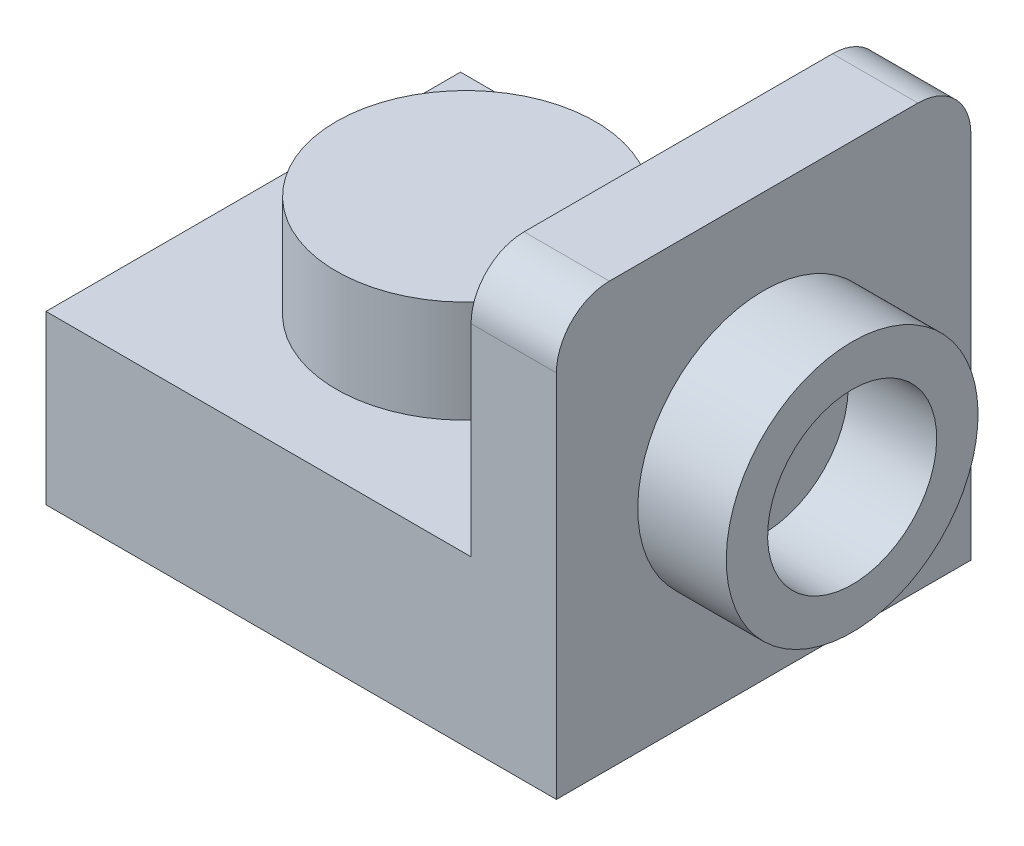
ISO-10303-21;
HEADER;
FILE_DESCRIPTION(('STEP AP214'),'2;1');
FILE_NAME('part.step','',(''),(''),'','','');
FILE_SCHEMA(('AUTOMOTIVE_DESIGN { 1 0 10303 214 1 1 1 1 }'));
ENDSEC;
DATA;
#1=APPLICATION_CONTEXT('core data for automotive mechanical design processes');
#2=APPLICATION_PROTOCOL_DEFINITION('international standard','automotive_design',2000,#1);
#3=PRODUCT_CONTEXT('',#1,'mechanical');
#4=PRODUCT('Part','Part','',(#3));
#5=PRODUCT_RELATED_PRODUCT_CATEGORY('part','',(#4));
#6=PRODUCT_DEFINITION_FORMATION('','',#4);
#7=PRODUCT_DEFINITION_CONTEXT('part definition',#1,'design');
#8=PRODUCT_DEFINITION('design','',#6,#7);
#9=PRODUCT_DEFINITION_SHAPE('','',#8);
#10=(LENGTH_UNIT() NAMED_UNIT(*) SI_UNIT(.MILLI.,.METRE.));
#11=(NAMED_UNIT(*) PLANE_ANGLE_UNIT() SI_UNIT($,.RADIAN.));
#12=(NAMED_UNIT(*) SI_UNIT($,.STERADIAN.) SOLID_ANGLE_UNIT());
#13=UNCERTAINTY_MEASURE_WITH_UNIT(LENGTH_MEASURE(1.E-05),#10,'distance_accuracy_value','');
#14=(GEOMETRIC_REPRESENTATION_CONTEXT(3) GLOBAL_UNCERTAINTY_ASSIGNED_CONTEXT((#13)) GLOBAL_UNIT_ASSIGNED_CONTEXT((#10,
#11,#12)) REPRESENTATION_CONTEXT('',''));
#15=CARTESIAN_POINT('',(0.,0.,0.));
#16=DIRECTION('',(0.,0.,1.));
#17=DIRECTION('',(1.,0.,0.));
#18=AXIS2_PLACEMENT_3D('',#15,#16,#17);
#19=CARTESIAN_POINT('',(-8.02,-3.16,-7.82));
#20=DIRECTION('',(0.,-1.,0.));
#21=DIRECTION('',(0.,0.,-1.));
#22=AXIS2_PLACEMENT_3D('',#19,#20,#21);
#23=PLANE('',#22);
#24=DIRECTION('',(1.,0.,0.));
#25=VECTOR('',#24,1.);
#26=CARTESIAN_POINT('',(-8.02,-3.16,0.));
#27=LINE('',#26,#25);
#28=CARTESIAN_POINT('',(-8.02,-3.16,0.));
#29=VERTEX_POINT('',#28);
#30=CARTESIAN_POINT('',(1.61,-3.16,0.));
#31=VERTEX_POINT('',#30);
#32=EDGE_CURVE('E211',#29,#31,#27,.T.);
#33=ORIENTED_EDGE('',*,*,#32,.F.);
#34=DIRECTION('',(0.,0.,1.));
#35=VECTOR('',#34,1.);
#36=CARTESIAN_POINT('',(-8.02,-3.16,-7.82));
#37=LINE('',#36,#35);
#38=CARTESIAN_POINT('',(-8.02,-3.16,-7.82));
#39=VERTEX_POINT('',#38);
#40=EDGE_CURVE('E223',#39,#29,#37,.T.);
#41=ORIENTED_EDGE('',*,*,#40,.F.);
#42=DIRECTION('',(1.,0.,0.));
#43=VECTOR('',#42,1.);
#44=CARTESIAN_POINT('',(-8.02,-3.16,-7.82));
#45=LINE('',#44,#43);
#46=CARTESIAN_POINT('',(1.61,-3.16,-7.82));
#47=VERTEX_POINT('',#46);
#48=EDGE_CURVE('E198',#39,#47,#45,.T.);
#49=ORIENTED_EDGE('',*,*,#48,.T.);
#50=DIRECTION('',(0.,0.,1.));
#51=VECTOR('',#50,1.);
#52=CARTESIAN_POINT('',(1.61,-3.16,-7.82));
#53=LINE('',#52,#51);
#54=EDGE_CURVE('E221',#47,#31,#53,.T.);
#55=ORIENTED_EDGE('',*,*,#54,.T.);
#56=EDGE_LOOP('',(#33,#41,#49,#55));
#57=FACE_BOUND('',#56,.T.);
#58=DIRECTION('',(0.,0.,1.));
#59=VECTOR('',#58,1.);
#60=CARTESIAN_POINT('',(-6.42,-3.16,-7.82));
#61=LINE('',#60,#59);
#62=CARTESIAN_POINT('',(-6.42,-3.16,-6.22));
#63=VERTEX_POINT('',#62);
#64=CARTESIAN_POINT('',(-6.42,-3.16,-1.6));
#65=VERTEX_POINT('',#64);
#66=EDGE_CURVE('E135',#63,#65,#61,.T.);
#67=ORIENTED_EDGE('',*,*,#66,.T.);
#68=DIRECTION('',(1.,0.,0.));
#69=VECTOR('',#68,1.);
#70=CARTESIAN_POINT('',(-8.02,-3.16,-1.6));
#71=LINE('',#70,#69);
#72=CARTESIAN_POINT('',(0.0100000000000002,-3.16,-1.6));
#73=VERTEX_POINT('',#72);
#74=EDGE_CURVE('E152',#65,#73,#71,.T.);
#75=ORIENTED_EDGE('',*,*,#74,.T.);
#76=DIRECTION('',(0.,0.,1.));
#77=VECTOR('',#76,1.);
#78=CARTESIAN_POINT('',(0.00999999999999959,-3.16,-7.82));
#79=LINE('',#78,#77);
#80=CARTESIAN_POINT('',(0.0100000000000002,-3.16,-6.22));
#81=VERTEX_POINT('',#80);
#82=EDGE_CURVE('E165',#81,#73,#79,.T.);
#83=ORIENTED_EDGE('',*,*,#82,.F.);
#84=DIRECTION('',(1.,0.,0.));
#85=VECTOR('',#84,1.);
#86=CARTESIAN_POINT('',(-8.02,-3.16,-6.22));
#87=LINE('',#86,#85);
#88=EDGE_CURVE('E144',#63,#81,#87,.T.);
#89=ORIENTED_EDGE('',*,*,#88,.F.);
#90=EDGE_LOOP('',(#67,#75,#83,#89));
#91=FACE_BOUND('',#90,.T.);
#92=ADVANCED_FACE('F32',(#57,#91),#23,.T.);
#93=CARTESIAN_POINT('',(0.,4.81,-7.82));
#94=DIRECTION('',(-1.,0.,0.));
#95=DIRECTION('',(0.,-1.,0.));
#96=AXIS2_PLACEMENT_3D('',#93,#94,#95);
#97=PLANE('',#96);
#98=DIRECTION('',(0.,0.,1.));
#99=VECTOR('',#98,1.);
#100=CARTESIAN_POINT('',(0.,4.81,-7.82));
#101=LINE('',#100,#99);
#102=CARTESIAN_POINT('',(0.,4.81,-6.82));
#103=VERTEX_POINT('',#102);
#104=CARTESIAN_POINT('',(0.,4.81,-1.));
#105=VERTEX_POINT('',#104);
#106=EDGE_CURVE('E215',#103,#105,#101,.T.);
#107=ORIENTED_EDGE('',*,*,#106,.F.);
#108=CARTESIAN_POINT('',(0.,3.81,-6.82));
#109=DIRECTION('',(-1.,0.,0.));
#110=DIRECTION('',(0.,-1.,0.));
#111=AXIS2_PLACEMENT_3D('',#108,#109,#110);
#112=CIRCLE('',#111,1.);
#113=CARTESIAN_POINT('',(0.,3.81,-7.82));
#114=VERTEX_POINT('',#113);
#115=EDGE_CURVE('E238',#103,#114,#112,.T.);
#116=ORIENTED_EDGE('',*,*,#115,.T.);
#117=DIRECTION('',(0.,-1.,0.));
#118=VECTOR('',#117,1.);
#119=CARTESIAN_POINT('',(0.,4.81,-7.82));
#120=LINE('',#119,#118);
#121=CARTESIAN_POINT('',(0.,0.,-7.82));
#122=VERTEX_POINT('',#121);
#123=EDGE_CURVE('E189',#114,#122,#120,.T.);
#124=ORIENTED_EDGE('',*,*,#123,.T.);
#125=DIRECTION('',(0.,0.,1.));
#126=VECTOR('',#125,1.);
#127=CARTESIAN_POINT('',(0.,0.,-7.82));
#128=LINE('',#127,#126);
#129=CARTESIAN_POINT('',(0.,0.,0.));
#130=VERTEX_POINT('',#129);
#131=EDGE_CURVE('E203',#122,#130,#128,.T.);
#132=ORIENTED_EDGE('',*,*,#131,.T.);
#133=DIRECTION('',(0.,-1.,0.));
#134=VECTOR('',#133,1.);
#135=CARTESIAN_POINT('',(0.,4.81,0.));
#136=LINE('',#135,#134);
#137=CARTESIAN_POINT('',(0.,3.81,0.));
#138=VERTEX_POINT('',#137);
#139=EDGE_CURVE('E186',#138,#130,#136,.T.);
#140=ORIENTED_EDGE('',*,*,#139,.F.);
#141=CARTESIAN_POINT('',(0.,3.81,-1.));
#142=DIRECTION('',(-1.,0.,0.));
#143=DIRECTION('',(0.,-1.,0.));
#144=AXIS2_PLACEMENT_3D('',#141,#142,#143);
#145=CIRCLE('',#144,1.);
#146=EDGE_CURVE('E236',#138,#105,#145,.T.);
#147=ORIENTED_EDGE('',*,*,#146,.T.);
#148=EDGE_LOOP('',(#107,#116,#124,#132,#140,#147));
#149=FACE_BOUND('',#148,.T.);
#150=ADVANCED_FACE('F252',(#149),#97,.T.);
#151=CARTESIAN_POINT('',(1.61,4.81,-7.82));
#152=DIRECTION('',(0.,1.,0.));
#153=DIRECTION('',(0.,0.,1.));
#154=AXIS2_PLACEMENT_3D('',#151,#152,#153);
#155=PLANE('',#154);
#156=DIRECTION('',(0.,0.,1.));
#157=VECTOR('',#156,1.);
#158=CARTESIAN_POINT('',(1.61,4.81,-7.82));
#159=LINE('',#158,#157);
#160=CARTESIAN_POINT('',(1.61,4.81,-6.82));
#161=VERTEX_POINT('',#160);
#162=CARTESIAN_POINT('',(1.61,4.81,-1.));
#163=VERTEX_POINT('',#162);
#164=EDGE_CURVE('E219',#161,#163,#159,.T.);
#165=ORIENTED_EDGE('',*,*,#164,.F.);
#166=DIRECTION('',(-1.,0.,0.));
#167=VECTOR('',#166,1.);
#168=CARTESIAN_POINT('',(1.61,4.81,-6.82));
#169=LINE('',#168,#167);
#170=EDGE_CURVE('E233',#161,#103,#169,.T.);
#171=ORIENTED_EDGE('',*,*,#170,.T.);
#172=ORIENTED_EDGE('',*,*,#106,.T.);
#173=DIRECTION('',(-1.,0.,0.));
#174=VECTOR('',#173,1.);
#175=CARTESIAN_POINT('',(1.61,4.81,-1.));
#176=LINE('',#175,#174);
#177=EDGE_CURVE('E231',#105,#163,#176,.F.);
#178=ORIENTED_EDGE('',*,*,#177,.T.);
#179=EDGE_LOOP('',(#165,#171,#172,#178));
#180=FACE_BOUND('',#179,.T.);
#181=ADVANCED_FACE('F247',(#180),#155,.T.);
#182=CARTESIAN_POINT('',(1.61,-3.16,-7.82));
#183=DIRECTION('',(1.,0.,0.));
#184=DIRECTION('',(0.,1.,0.));
#185=AXIS2_PLACEMENT_3D('',#182,#183,#184);
#186=PLANE('',#185);
#187=CARTESIAN_POINT('',(1.61,0.824999999999998,-3.91));
#188=DIRECTION('',(1.,0.,0.));
#189=DIRECTION('',(0.,1.,0.));
#190=AXIS2_PLACEMENT_3D('',#187,#188,#189);
#191=CIRCLE('',#190,2.375);
#192=CARTESIAN_POINT('',(1.61,3.2,-3.91));
#193=VERTEX_POINT('',#192);
#194=EDGE_CURVE('E176',#193,#193,#191,.T.);
#195=ORIENTED_EDGE('',*,*,#194,.F.);
#196=EDGE_LOOP('',(#195));
#197=FACE_BOUND('',#196,.T.);
#198=DIRECTION('',(0.,1.,0.));
#199=VECTOR('',#198,1.);
#200=CARTESIAN_POINT('',(1.61,-3.16,-7.82));
#201=LINE('',#200,#199);
#202=CARTESIAN_POINT('',(1.61,3.81,-7.82));
#203=VERTEX_POINT('',#202);
#204=EDGE_CURVE('E201',#47,#203,#201,.T.);
#205=ORIENTED_EDGE('',*,*,#204,.T.);
#206=CARTESIAN_POINT('',(1.61,3.81,-6.82));
#207=DIRECTION('',(1.,0.,0.));
#208=DIRECTION('',(0.,1.,0.));
#209=AXIS2_PLACEMENT_3D('',#206,#207,#208);
#210=CIRCLE('',#209,1.);
#211=EDGE_CURVE('E40',#203,#161,#210,.T.);
#212=ORIENTED_EDGE('',*,*,#211,.T.);
#213=ORIENTED_EDGE('',*,*,#164,.T.);
#214=CARTESIAN_POINT('',(1.61,3.81,-1.));
#215=DIRECTION('',(1.,0.,0.));
#216=DIRECTION('',(0.,1.,0.));
#217=AXIS2_PLACEMENT_3D('',#214,#215,#216);
#218=CIRCLE('',#217,1.);
#219=CARTESIAN_POINT('',(1.61,3.81,0.));
#220=VERTEX_POINT('',#219);
#221=EDGE_CURVE('E47',#163,#220,#218,.T.);
#222=ORIENTED_EDGE('',*,*,#221,.T.);
#223=DIRECTION('',(0.,1.,0.));
#224=VECTOR('',#223,1.);
#225=CARTESIAN_POINT('',(1.61,-3.16,0.));
#226=LINE('',#225,#224);
#227=EDGE_CURVE('E192',#31,#220,#226,.T.);
#228=ORIENTED_EDGE('',*,*,#227,.F.);
#229=ORIENTED_EDGE('',*,*,#54,.F.);
#230=EDGE_LOOP('',(#205,#212,#213,#222,#228,#229));
#231=FACE_BOUND('',#230,.T.);
#232=ADVANCED_FACE('F243',(#197,#231),#186,.T.);
#233=CARTESIAN_POINT('',(-8.02,0.,-7.82));
#234=DIRECTION('',(-1.,0.,0.));
#235=DIRECTION('',(0.,0.,1.));
#236=AXIS2_PLACEMENT_3D('',#233,#234,#235);
#237=PLANE('',#236);
#238=DIRECTION('',(0.,-1.,0.));
#239=VECTOR('',#238,1.);
#240=CARTESIAN_POINT('',(-8.02,0.,0.));
#241=LINE('',#240,#239);
#242=CARTESIAN_POINT('',(-8.02,0.,0.));
#243=VERTEX_POINT('',#242);
#244=EDGE_CURVE('E208',#243,#29,#241,.T.);
#245=ORIENTED_EDGE('',*,*,#244,.F.);
#246=DIRECTION('',(0.,0.,1.));
#247=VECTOR('',#246,1.);
#248=CARTESIAN_POINT('',(-8.02,0.,-7.82));
#249=LINE('',#248,#247);
#250=CARTESIAN_POINT('',(-8.02,0.,-7.82));
#251=VERTEX_POINT('',#250);
#252=EDGE_CURVE('E225',#251,#243,#249,.T.);
#253=ORIENTED_EDGE('',*,*,#252,.F.);
#254=DIRECTION('',(0.,-1.,0.));
#255=VECTOR('',#254,1.);
#256=CARTESIAN_POINT('',(-8.02,0.,-7.82));
#257=LINE('',#256,#255);
#258=EDGE_CURVE('E195',#251,#39,#257,.T.);
#259=ORIENTED_EDGE('',*,*,#258,.T.);
#260=ORIENTED_EDGE('',*,*,#40,.T.);
#261=EDGE_LOOP('',(#245,#253,#259,#260));
#262=FACE_BOUND('',#261,.T.);
#263=ADVANCED_FACE('F284',(#262),#237,.T.);
#264=CARTESIAN_POINT('',(0.,0.,-7.82));
#265=DIRECTION('',(0.,1.,0.));
#266=DIRECTION('',(-1.,0.,0.));
#267=AXIS2_PLACEMENT_3D('',#264,#265,#266);
#268=PLANE('',#267);
#269=CARTESIAN_POINT('',(-4.01,0.,-3.91));
#270=DIRECTION('',(0.,1.,0.));
#271=DIRECTION('',(-1.,0.,0.));
#272=AXIS2_PLACEMENT_3D('',#269,#270,#271);
#273=CIRCLE('',#272,2.445);
#274=CARTESIAN_POINT('',(-6.455,0.,-3.91));
#275=VERTEX_POINT('',#274);
#276=EDGE_CURVE('E180',#275,#275,#273,.T.);
#277=ORIENTED_EDGE('',*,*,#276,.F.);
#278=EDGE_LOOP('',(#277));
#279=FACE_BOUND('',#278,.T.);
#280=DIRECTION('',(-1.,0.,0.));
#281=VECTOR('',#280,1.);
#282=CARTESIAN_POINT('',(0.,0.,0.));
#283=LINE('',#282,#281);
#284=EDGE_CURVE('E205',#130,#243,#283,.T.);
#285=ORIENTED_EDGE('',*,*,#284,.F.);
#286=ORIENTED_EDGE('',*,*,#131,.F.);
#287=DIRECTION('',(-1.,0.,0.));
#288=VECTOR('',#287,1.);
#289=CARTESIAN_POINT('',(0.,0.,-7.82));
#290=LINE('',#289,#288);
#291=EDGE_CURVE('E191',#122,#251,#290,.T.);
#292=ORIENTED_EDGE('',*,*,#291,.T.);
#293=ORIENTED_EDGE('',*,*,#252,.T.);
#294=EDGE_LOOP('',(#285,#286,#292,#293));
#295=FACE_BOUND('',#294,.T.);
#296=ADVANCED_FACE('F260',(#279,#295),#268,.T.);
#297=CARTESIAN_POINT('',(0.,0.,-7.82));
#298=DIRECTION('',(0.,0.,-1.));
#299=DIRECTION('',(-1.,0.,0.));
#300=AXIS2_PLACEMENT_3D('',#297,#298,#299);
#301=PLANE('',#300);
#302=ORIENTED_EDGE('',*,*,#123,.F.);
#303=DIRECTION('',(-1.,0.,0.));
#304=VECTOR('',#303,1.);
#305=CARTESIAN_POINT('',(0.,3.81,-7.82));
#306=LINE('',#305,#304);
#307=EDGE_CURVE('E55',#114,#203,#306,.F.);
#308=ORIENTED_EDGE('',*,*,#307,.T.);
#309=ORIENTED_EDGE('',*,*,#204,.F.);
#310=ORIENTED_EDGE('',*,*,#48,.F.);
#311=ORIENTED_EDGE('',*,*,#258,.F.);
#312=ORIENTED_EDGE('',*,*,#291,.F.);
#313=EDGE_LOOP('',(#302,#308,#309,#310,#311,#312));
#314=FACE_BOUND('',#313,.T.);
#315=ADVANCED_FACE('F255',(#314),#301,.T.);
#316=CARTESIAN_POINT('',(0.,0.,0.));
#317=DIRECTION('',(0.,0.,-1.));
#318=DIRECTION('',(-1.,0.,0.));
#319=AXIS2_PLACEMENT_3D('',#316,#317,#318);
#320=PLANE('',#319);
#321=ORIENTED_EDGE('',*,*,#227,.T.);
#322=DIRECTION('',(-1.,0.,0.));
#323=VECTOR('',#322,1.);
#324=CARTESIAN_POINT('',(0.,3.81,0.));
#325=LINE('',#324,#323);
#326=EDGE_CURVE('E11',#220,#138,#325,.T.);
#327=ORIENTED_EDGE('',*,*,#326,.T.);
#328=ORIENTED_EDGE('',*,*,#139,.T.);
#329=ORIENTED_EDGE('',*,*,#284,.T.);
#330=ORIENTED_EDGE('',*,*,#244,.T.);
#331=ORIENTED_EDGE('',*,*,#32,.T.);
#332=EDGE_LOOP('',(#321,#327,#328,#329,#330,#331));
#333=FACE_BOUND('',#332,.T.);
#334=ADVANCED_FACE('F264',(#333),#320,.F.);
#335=CARTESIAN_POINT('',(-4.01,1.93,-3.91));
#336=DIRECTION('',(0.,-1.,0.));
#337=DIRECTION('',(1.,0.,0.));
#338=AXIS2_PLACEMENT_3D('',#335,#336,#337);
#339=CYLINDRICAL_SURFACE('',#338,2.445);
#340=CARTESIAN_POINT('',(-4.01,1.93,-3.91));
#341=DIRECTION('',(0.,1.,0.));
#342=DIRECTION('',(-1.,0.,0.));
#343=AXIS2_PLACEMENT_3D('',#340,#341,#342);
#344=CIRCLE('',#343,2.445);
#345=CARTESIAN_POINT('',(-6.455,1.93,-3.91));
#346=VERTEX_POINT('',#345);
#347=EDGE_CURVE('E183',#346,#346,#344,.T.);
#348=ORIENTED_EDGE('',*,*,#347,.F.);
#349=EDGE_LOOP('',(#348));
#350=FACE_BOUND('',#349,.T.);
#351=ORIENTED_EDGE('',*,*,#276,.T.);
#352=EDGE_LOOP('',(#351));
#353=FACE_BOUND('',#352,.T.);
#354=ADVANCED_FACE('F296',(#350,#353),#339,.T.);
#355=CARTESIAN_POINT('',(-4.01,1.93,-3.91));
#356=DIRECTION('',(0.,1.,0.));
#357=DIRECTION('',(-1.,0.,0.));
#358=AXIS2_PLACEMENT_3D('',#355,#356,#357);
#359=PLANE('',#358);
#360=ORIENTED_EDGE('',*,*,#347,.T.);
#361=EDGE_LOOP('',(#360));
#362=FACE_BOUND('',#361,.T.);
#363=ADVANCED_FACE('F298',(#362),#359,.T.);
#364=CARTESIAN_POINT('',(3.28,0.824999999999998,-3.91));
#365=DIRECTION('',(1.,0.,0.));
#366=DIRECTION('',(0.,1.,0.));
#367=AXIS2_PLACEMENT_3D('',#364,#365,#366);
#368=PLANE('',#367);
#369=CARTESIAN_POINT('',(3.28,0.824999999999998,-3.91));
#370=DIRECTION('',(1.,0.,0.));
#371=DIRECTION('',(0.,1.,0.));
#372=AXIS2_PLACEMENT_3D('',#369,#370,#371);
#373=CIRCLE('',#372,2.375);
#374=CARTESIAN_POINT('',(3.28,3.2,-3.91));
#375=VERTEX_POINT('',#374);
#376=EDGE_CURVE('E177',#375,#375,#373,.T.);
#377=ORIENTED_EDGE('',*,*,#376,.T.);
#378=EDGE_LOOP('',(#377));
#379=FACE_BOUND('',#378,.T.);
#380=CARTESIAN_POINT('',(3.28,0.824999999999998,-3.91));
#381=DIRECTION('',(1.,0.,0.));
#382=DIRECTION('',(0.,1.,0.));
#383=AXIS2_PLACEMENT_3D('',#380,#381,#382);
#384=CIRCLE('',#383,1.595);
#385=CARTESIAN_POINT('',(3.28,2.42,-3.91));
#386=VERTEX_POINT('',#385);
#387=EDGE_CURVE('E173',#386,#386,#384,.T.);
#388=ORIENTED_EDGE('',*,*,#387,.F.);
#389=EDGE_LOOP('',(#388));
#390=FACE_BOUND('',#389,.T.);
#391=ADVANCED_FACE('F305',(#379,#390),#368,.T.);
#392=CARTESIAN_POINT('',(3.28,0.824999999999998,-3.91));
#393=DIRECTION('',(-1.,0.,0.));
#394=DIRECTION('',(0.,-1.,0.));
#395=AXIS2_PLACEMENT_3D('',#392,#393,#394);
#396=CYLINDRICAL_SURFACE('',#395,2.375);
#397=ORIENTED_EDGE('',*,*,#376,.F.);
#398=EDGE_LOOP('',(#397));
#399=FACE_BOUND('',#398,.T.);
#400=ORIENTED_EDGE('',*,*,#194,.T.);
#401=EDGE_LOOP('',(#400));
#402=FACE_BOUND('',#401,.T.);
#403=ADVANCED_FACE('F330',(#399,#402),#396,.T.);
#404=CARTESIAN_POINT('',(3.28,0.824999999999998,-3.91));
#405=DIRECTION('',(-1.,0.,0.));
#406=DIRECTION('',(0.,-1.,0.));
#407=AXIS2_PLACEMENT_3D('',#404,#405,#406);
#408=CYLINDRICAL_SURFACE('',#407,1.595);
#409=ORIENTED_EDGE('',*,*,#387,.T.);
#410=EDGE_LOOP('',(#409));
#411=FACE_BOUND('',#410,.T.);
#412=CARTESIAN_POINT('',(1.61,0.824999999999998,-3.91));
#413=DIRECTION('',(1.,0.,0.));
#414=DIRECTION('',(0.,1.,0.));
#415=AXIS2_PLACEMENT_3D('',#412,#413,#414);
#416=CIRCLE('',#415,1.595);
#417=CARTESIAN_POINT('',(1.61,2.42,-3.91));
#418=VERTEX_POINT('',#417);
#419=EDGE_CURVE('E218',#418,#418,#416,.F.);
#420=ORIENTED_EDGE('',*,*,#419,.T.);
#421=EDGE_LOOP('',(#420));
#422=FACE_BOUND('',#421,.T.);
#423=ADVANCED_FACE('F322',(#411,#422),#408,.F.);
#424=ORIENTED_EDGE('',*,*,#419,.F.);
#425=EDGE_LOOP('',(#424));
#426=FACE_BOUND('',#425,.T.);
#427=ADVANCED_FACE('F316',(#426),#186,.T.);
#428=CARTESIAN_POINT('',(0.0100000000000002,-3.16,-7.82));
#429=DIRECTION('',(1.,0.,0.));
#430=DIRECTION('',(0.,1.,0.));
#431=AXIS2_PLACEMENT_3D('',#428,#429,#430);
#432=PLANE('',#431);
#433=DIRECTION('',(0.,0.,-1.));
#434=VECTOR('',#433,1.);
#435=CARTESIAN_POINT('',(0.0100000000000004,-1.6,-7.82));
#436=LINE('',#435,#434);
#437=CARTESIAN_POINT('',(0.0100000000000005,-1.6,-1.6));
#438=VERTEX_POINT('',#437);
#439=CARTESIAN_POINT('',(0.0100000000000005,-1.6,-6.22));
#440=VERTEX_POINT('',#439);
#441=EDGE_CURVE('E167',#438,#440,#436,.T.);
#442=ORIENTED_EDGE('',*,*,#441,.T.);
#443=DIRECTION('',(0.,1.,0.));
#444=VECTOR('',#443,1.);
#445=CARTESIAN_POINT('',(0.0100000000000002,-3.16,-6.22));
#446=LINE('',#445,#444);
#447=EDGE_CURVE('E136',#81,#440,#446,.T.);
#448=ORIENTED_EDGE('',*,*,#447,.F.);
#449=ORIENTED_EDGE('',*,*,#82,.T.);
#450=DIRECTION('',(0.,1.,0.));
#451=VECTOR('',#450,1.);
#452=CARTESIAN_POINT('',(0.0100000000000002,-3.16,-1.6));
#453=LINE('',#452,#451);
#454=EDGE_CURVE('E149',#73,#438,#453,.T.);
#455=ORIENTED_EDGE('',*,*,#454,.T.);
#456=EDGE_LOOP('',(#442,#448,#449,#455));
#457=FACE_BOUND('',#456,.T.);
#458=ADVANCED_FACE('F321',(#457),#432,.F.);
#459=CARTESIAN_POINT('',(-6.42,0.,-7.82));
#460=DIRECTION('',(-1.,0.,0.));
#461=DIRECTION('',(0.,0.,1.));
#462=AXIS2_PLACEMENT_3D('',#459,#460,#461);
#463=PLANE('',#462);
#464=DIRECTION('',(0.,-1.,0.));
#465=VECTOR('',#464,1.);
#466=CARTESIAN_POINT('',(-6.42,0.,-1.6));
#467=LINE('',#466,#465);
#468=CARTESIAN_POINT('',(-6.42,-1.6,-1.6));
#469=VERTEX_POINT('',#468);
#470=EDGE_CURVE('E156',#469,#65,#467,.T.);
#471=ORIENTED_EDGE('',*,*,#470,.T.);
#472=ORIENTED_EDGE('',*,*,#66,.F.);
#473=DIRECTION('',(0.,-1.,0.));
#474=VECTOR('',#473,1.);
#475=CARTESIAN_POINT('',(-6.42,0.,-6.22));
#476=LINE('',#475,#474);
#477=CARTESIAN_POINT('',(-6.42,-1.6,-6.22));
#478=VERTEX_POINT('',#477);
#479=EDGE_CURVE('E139',#478,#63,#476,.T.);
#480=ORIENTED_EDGE('',*,*,#479,.F.);
#481=DIRECTION('',(0.,0.,1.));
#482=VECTOR('',#481,1.);
#483=CARTESIAN_POINT('',(-6.42,-1.6,-7.82));
#484=LINE('',#483,#482);
#485=EDGE_CURVE('E125',#478,#469,#484,.T.);
#486=ORIENTED_EDGE('',*,*,#485,.T.);
#487=EDGE_LOOP('',(#471,#472,#480,#486));
#488=FACE_BOUND('',#487,.T.);
#489=ADVANCED_FACE('F140',(#488),#463,.F.);
#490=CARTESIAN_POINT('',(0.,-1.6,-7.82));
#491=DIRECTION('',(0.,1.,0.));
#492=DIRECTION('',(-1.,0.,0.));
#493=AXIS2_PLACEMENT_3D('',#490,#491,#492);
#494=PLANE('',#493);
#495=CARTESIAN_POINT('',(-4.01,-1.6,-3.91));
#496=DIRECTION('',(0.,1.,0.));
#497=DIRECTION('',(-1.,0.,0.));
#498=AXIS2_PLACEMENT_3D('',#495,#496,#497);
#499=CIRCLE('',#498,0.845);
#500=CARTESIAN_POINT('',(-4.855,-1.6,-3.91));
#501=VERTEX_POINT('',#500);
#502=EDGE_CURVE('E158',#501,#501,#499,.T.);
#503=ORIENTED_EDGE('',*,*,#502,.T.);
#504=EDGE_LOOP('',(#503));
#505=FACE_BOUND('',#504,.T.);
#506=DIRECTION('',(-1.,0.,0.));
#507=VECTOR('',#506,1.);
#508=CARTESIAN_POINT('',(0.,-1.6,-1.6));
#509=LINE('',#508,#507);
#510=EDGE_CURVE('E131',#438,#469,#509,.T.);
#511=ORIENTED_EDGE('',*,*,#510,.T.);
#512=ORIENTED_EDGE('',*,*,#485,.F.);
#513=DIRECTION('',(-1.,0.,0.));
#514=VECTOR('',#513,1.);
#515=CARTESIAN_POINT('',(0.,-1.6,-6.22));
#516=LINE('',#515,#514);
#517=EDGE_CURVE('E129',#440,#478,#516,.T.);
#518=ORIENTED_EDGE('',*,*,#517,.F.);
#519=ORIENTED_EDGE('',*,*,#441,.F.);
#520=EDGE_LOOP('',(#511,#512,#518,#519));
#521=FACE_BOUND('',#520,.T.);
#522=ADVANCED_FACE('F127',(#505,#521),#494,.F.);
#523=CARTESIAN_POINT('',(0.,0.,-6.22));
#524=DIRECTION('',(0.,0.,-1.));
#525=DIRECTION('',(-1.,0.,0.));
#526=AXIS2_PLACEMENT_3D('',#523,#524,#525);
#527=PLANE('',#526);
#528=ORIENTED_EDGE('',*,*,#517,.T.);
#529=ORIENTED_EDGE('',*,*,#479,.T.);
#530=ORIENTED_EDGE('',*,*,#88,.T.);
#531=ORIENTED_EDGE('',*,*,#447,.T.);
#532=EDGE_LOOP('',(#528,#529,#530,#531));
#533=FACE_BOUND('',#532,.T.);
#534=ADVANCED_FACE('F147',(#533),#527,.F.);
#535=CARTESIAN_POINT('',(0.,0.,-1.6));
#536=DIRECTION('',(0.,0.,-1.));
#537=DIRECTION('',(-1.,0.,0.));
#538=AXIS2_PLACEMENT_3D('',#535,#536,#537);
#539=PLANE('',#538);
#540=ORIENTED_EDGE('',*,*,#454,.F.);
#541=ORIENTED_EDGE('',*,*,#74,.F.);
#542=ORIENTED_EDGE('',*,*,#470,.F.);
#543=ORIENTED_EDGE('',*,*,#510,.F.);
#544=EDGE_LOOP('',(#540,#541,#542,#543));
#545=FACE_BOUND('',#544,.T.);
#546=ADVANCED_FACE('F401',(#545),#539,.T.);
#547=CARTESIAN_POINT('',(-4.01,1.93,-3.91));
#548=DIRECTION('',(0.,-1.,0.));
#549=DIRECTION('',(1.,0.,0.));
#550=AXIS2_PLACEMENT_3D('',#547,#548,#549);
#551=CYLINDRICAL_SURFACE('',#550,0.845);
#552=CARTESIAN_POINT('',(-4.01,0.329999999999999,-3.91));
#553=DIRECTION('',(0.,1.,0.));
#554=DIRECTION('',(-1.,0.,0.));
#555=AXIS2_PLACEMENT_3D('',#552,#553,#554);
#556=CIRCLE('',#555,0.845);
#557=CARTESIAN_POINT('',(-4.855,0.329999999999999,-3.91));
#558=VERTEX_POINT('',#557);
#559=EDGE_CURVE('E161',#558,#558,#556,.T.);
#560=ORIENTED_EDGE('',*,*,#559,.T.);
#561=EDGE_LOOP('',(#560));
#562=FACE_BOUND('',#561,.T.);
#563=ORIENTED_EDGE('',*,*,#502,.F.);
#564=EDGE_LOOP('',(#563));
#565=FACE_BOUND('',#564,.T.);
#566=ADVANCED_FACE('F410',(#562,#565),#551,.F.);
#567=CARTESIAN_POINT('',(-4.01,0.329999999999999,-3.91));
#568=DIRECTION('',(0.,1.,0.));
#569=DIRECTION('',(-1.,0.,0.));
#570=AXIS2_PLACEMENT_3D('',#567,#568,#569);
#571=PLANE('',#570);
#572=ORIENTED_EDGE('',*,*,#559,.F.);
#573=EDGE_LOOP('',(#572));
#574=FACE_BOUND('',#573,.T.);
#575=ADVANCED_FACE('F271',(#574),#571,.F.);
#576=CARTESIAN_POINT('',(1.61,3.81,-6.82));
#577=DIRECTION('',(-1.,0.,0.));
#578=DIRECTION('',(0.,0.,1.));
#579=AXIS2_PLACEMENT_3D('',#576,#577,#578);
#580=CYLINDRICAL_SURFACE('',#579,1.);
#581=ORIENTED_EDGE('',*,*,#211,.F.);
#582=ORIENTED_EDGE('',*,*,#307,.F.);
#583=ORIENTED_EDGE('',*,*,#115,.F.);
#584=ORIENTED_EDGE('',*,*,#170,.F.);
#585=EDGE_LOOP('',(#581,#582,#583,#584));
#586=FACE_BOUND('',#585,.T.);
#587=ADVANCED_FACE('F250',(#586),#580,.T.);
#588=CARTESIAN_POINT('',(0.,3.81,-1.));
#589=DIRECTION('',(1.,0.,0.));
#590=DIRECTION('',(0.,0.,-1.));
#591=AXIS2_PLACEMENT_3D('',#588,#589,#590);
#592=CYLINDRICAL_SURFACE('',#591,1.);
#593=ORIENTED_EDGE('',*,*,#221,.F.);
#594=ORIENTED_EDGE('',*,*,#177,.F.);
#595=ORIENTED_EDGE('',*,*,#146,.F.);
#596=ORIENTED_EDGE('',*,*,#326,.F.);
#597=EDGE_LOOP('',(#593,#594,#595,#596));
#598=FACE_BOUND('',#597,.T.);
#599=ADVANCED_FACE('F34',(#598),#592,.T.);
#600=CLOSED_SHELL('',(#92,#150,#181,#232,#263,#296,#315,#334,#354,#363,#391,#403,#423,#427,#458,
#489,#522,#534,#546,#566,#575,#587,#599));
#601=MANIFOLD_SOLID_BREP('B2',#600);
#602=ADVANCED_BREP_SHAPE_REPRESENTATION('',(#18,#601),#14);
#603=SHAPE_DEFINITION_REPRESENTATION(#9,#602);
ENDSEC;
END-ISO-10303-21;
